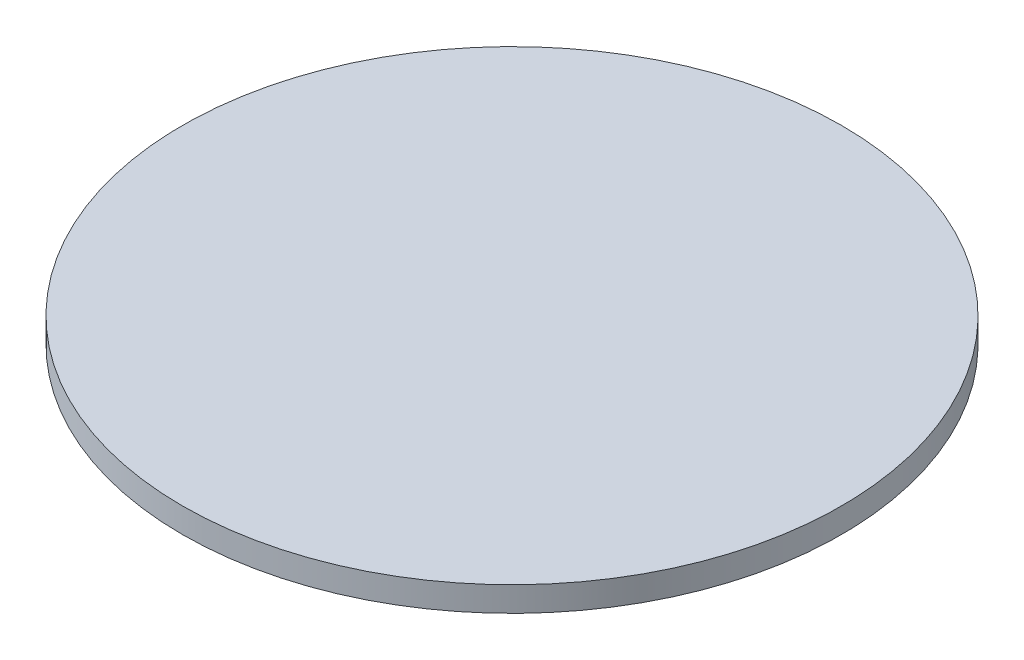
ISO-10303-21;
HEADER;
FILE_DESCRIPTION(('STEP AP214'),'2;1');
FILE_NAME('part.step','',(''),(''),'','','');
FILE_SCHEMA(('AUTOMOTIVE_DESIGN { 1 0 10303 214 1 1 1 1 }'));
ENDSEC;
DATA;
#1=APPLICATION_CONTEXT('core data for automotive mechanical design processes');
#2=APPLICATION_PROTOCOL_DEFINITION('international standard','automotive_design',2000,#1);
#3=PRODUCT_CONTEXT('',#1,'mechanical');
#4=PRODUCT('Part','Part','',(#3));
#5=PRODUCT_RELATED_PRODUCT_CATEGORY('part','',(#4));
#6=PRODUCT_DEFINITION_FORMATION('','',#4);
#7=PRODUCT_DEFINITION_CONTEXT('part definition',#1,'design');
#8=PRODUCT_DEFINITION('design','',#6,#7);
#9=PRODUCT_DEFINITION_SHAPE('','',#8);
#10=(LENGTH_UNIT() NAMED_UNIT(*) SI_UNIT(.MILLI.,.METRE.));
#11=(NAMED_UNIT(*) PLANE_ANGLE_UNIT() SI_UNIT($,.RADIAN.));
#12=(NAMED_UNIT(*) SI_UNIT($,.STERADIAN.) SOLID_ANGLE_UNIT());
#13=UNCERTAINTY_MEASURE_WITH_UNIT(LENGTH_MEASURE(1.E-05),#10,'distance_accuracy_value','');
#14=(GEOMETRIC_REPRESENTATION_CONTEXT(3) GLOBAL_UNCERTAINTY_ASSIGNED_CONTEXT((#13)) GLOBAL_UNIT_ASSIGNED_CONTEXT((#10,
#11,#12)) REPRESENTATION_CONTEXT('',''));
#15=CARTESIAN_POINT('',(0.,0.,0.));
#16=DIRECTION('',(0.,0.,1.));
#17=DIRECTION('',(1.,0.,0.));
#18=AXIS2_PLACEMENT_3D('',#15,#16,#17);
#19=CARTESIAN_POINT('',(0.,3.175,0.));
#20=DIRECTION('',(0.,-1.,0.));
#21=DIRECTION('',(0.,0.,-1.));
#22=AXIS2_PLACEMENT_3D('',#19,#20,#21);
#23=CYLINDRICAL_SURFACE('',#22,42.164);
#24=CARTESIAN_POINT('',(0.,3.175,0.));
#25=DIRECTION('',(0.,1.,0.));
#26=DIRECTION('',(0.,0.,1.));
#27=AXIS2_PLACEMENT_3D('',#24,#25,#26);
#28=CIRCLE('',#27,42.164);
#29=CARTESIAN_POINT('',(0.,3.175,42.164));
#30=VERTEX_POINT('',#29);
#31=EDGE_CURVE('E10',#30,#30,#28,.T.);
#32=ORIENTED_EDGE('',*,*,#31,.F.);
#33=EDGE_LOOP('',(#32));
#34=FACE_BOUND('',#33,.T.);
#35=CARTESIAN_POINT('',(0.,0.,0.));
#36=DIRECTION('',(0.,1.,0.));
#37=DIRECTION('',(0.,0.,1.));
#38=AXIS2_PLACEMENT_3D('',#35,#36,#37);
#39=CIRCLE('',#38,42.164);
#40=CARTESIAN_POINT('',(0.,0.,42.164));
#41=VERTEX_POINT('',#40);
#42=EDGE_CURVE('E34',#41,#41,#39,.T.);
#43=ORIENTED_EDGE('',*,*,#42,.T.);
#44=EDGE_LOOP('',(#43));
#45=FACE_BOUND('',#44,.T.);
#46=ADVANCED_FACE('F31',(#34,#45),#23,.T.);
#47=CARTESIAN_POINT('',(0.,3.175,0.));
#48=DIRECTION('',(0.,1.,0.));
#49=DIRECTION('',(0.,0.,1.));
#50=AXIS2_PLACEMENT_3D('',#47,#48,#49);
#51=PLANE('',#50);
#52=ORIENTED_EDGE('',*,*,#31,.T.);
#53=EDGE_LOOP('',(#52));
#54=FACE_BOUND('',#53,.T.);
#55=ADVANCED_FACE('F46',(#54),#51,.T.);
#56=CARTESIAN_POINT('',(0.,0.,0.));
#57=DIRECTION('',(0.,1.,0.));
#58=DIRECTION('',(0.,0.,1.));
#59=AXIS2_PLACEMENT_3D('',#56,#57,#58);
#60=PLANE('',#59);
#61=ORIENTED_EDGE('',*,*,#42,.F.);
#62=EDGE_LOOP('',(#61));
#63=FACE_BOUND('',#62,.T.);
#64=ADVANCED_FACE('F44',(#63),#60,.F.);
#65=CLOSED_SHELL('',(#46,#55,#64));
#66=MANIFOLD_SOLID_BREP('B2',#65);
#67=ADVANCED_BREP_SHAPE_REPRESENTATION('',(#18,#66),#14);
#68=SHAPE_DEFINITION_REPRESENTATION(#9,#67);
ENDSEC;
END-ISO-10303-21;
